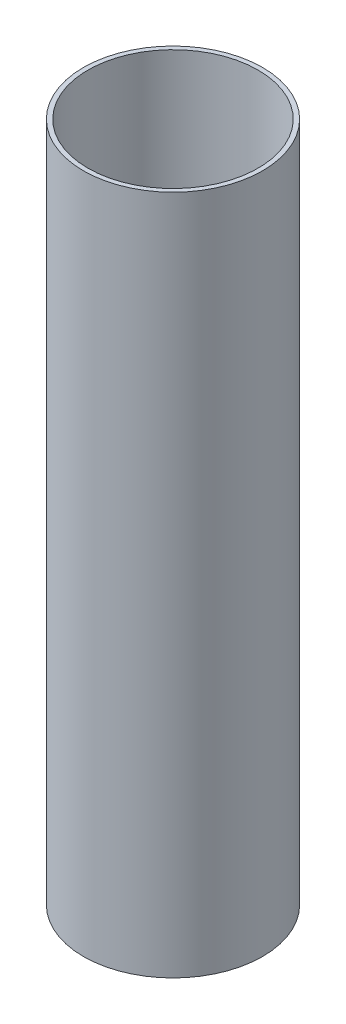
ISO-10303-21;
HEADER;
FILE_DESCRIPTION(('STEP AP214'),'2;1');
FILE_NAME('part.step','',(''),(''),'','','');
FILE_SCHEMA(('AUTOMOTIVE_DESIGN { 1 0 10303 214 1 1 1 1 }'));
ENDSEC;
DATA;
#1=APPLICATION_CONTEXT('core data for automotive mechanical design processes');
#2=APPLICATION_PROTOCOL_DEFINITION('international standard','automotive_design',2000,#1);
#3=PRODUCT_CONTEXT('',#1,'mechanical');
#4=PRODUCT('Part','Part','',(#3));
#5=PRODUCT_RELATED_PRODUCT_CATEGORY('part','',(#4));
#6=PRODUCT_DEFINITION_FORMATION('','',#4);
#7=PRODUCT_DEFINITION_CONTEXT('part definition',#1,'design');
#8=PRODUCT_DEFINITION('design','',#6,#7);
#9=PRODUCT_DEFINITION_SHAPE('','',#8);
#10=(LENGTH_UNIT() NAMED_UNIT(*) SI_UNIT(.MILLI.,.METRE.));
#11=(NAMED_UNIT(*) PLANE_ANGLE_UNIT() SI_UNIT($,.RADIAN.));
#12=(NAMED_UNIT(*) SI_UNIT($,.STERADIAN.) SOLID_ANGLE_UNIT());
#13=UNCERTAINTY_MEASURE_WITH_UNIT(LENGTH_MEASURE(1.E-05),#10,'distance_accuracy_value','');
#14=(GEOMETRIC_REPRESENTATION_CONTEXT(3) GLOBAL_UNCERTAINTY_ASSIGNED_CONTEXT((#13)) GLOBAL_UNIT_ASSIGNED_CONTEXT((#10,
#11,#12)) REPRESENTATION_CONTEXT('',''));
#15=CARTESIAN_POINT('',(0.,0.,0.));
#16=DIRECTION('',(0.,0.,1.));
#17=DIRECTION('',(1.,0.,0.));
#18=AXIS2_PLACEMENT_3D('',#15,#16,#17);
#19=CARTESIAN_POINT('',(0.,125.,0.));
#20=DIRECTION('',(0.,1.,0.));
#21=DIRECTION('',(0.,0.,1.));
#22=AXIS2_PLACEMENT_3D('',#19,#20,#21);
#23=PLANE('',#22);
#24=CARTESIAN_POINT('',(0.,125.,0.));
#25=DIRECTION('',(0.,1.,0.));
#26=DIRECTION('',(0.,0.,1.));
#27=AXIS2_PLACEMENT_3D('',#24,#25,#26);
#28=CIRCLE('',#27,32.9);
#29=CARTESIAN_POINT('',(0.,125.,32.9));
#30=VERTEX_POINT('',#29);
#31=EDGE_CURVE('E10',#30,#30,#28,.T.);
#32=ORIENTED_EDGE('',*,*,#31,.T.);
#33=EDGE_LOOP('',(#32));
#34=FACE_BOUND('',#33,.T.);
#35=CARTESIAN_POINT('',(0.,125.,0.));
#36=DIRECTION('',(0.,1.,0.));
#37=DIRECTION('',(0.,0.,1.));
#38=AXIS2_PLACEMENT_3D('',#35,#36,#37);
#39=CIRCLE('',#38,31.25);
#40=CARTESIAN_POINT('',(0.,125.,31.25));
#41=VERTEX_POINT('',#40);
#42=EDGE_CURVE('E42',#41,#41,#39,.T.);
#43=ORIENTED_EDGE('',*,*,#42,.F.);
#44=EDGE_LOOP('',(#43));
#45=FACE_BOUND('',#44,.T.);
#46=ADVANCED_FACE('F31',(#34,#45),#23,.T.);
#47=CARTESIAN_POINT('',(0.,-125.,0.));
#48=DIRECTION('',(0.,1.,0.));
#49=DIRECTION('',(0.,0.,1.));
#50=AXIS2_PLACEMENT_3D('',#47,#48,#49);
#51=PLANE('',#50);
#52=CARTESIAN_POINT('',(0.,-125.,0.));
#53=DIRECTION('',(0.,1.,0.));
#54=DIRECTION('',(0.,0.,1.));
#55=AXIS2_PLACEMENT_3D('',#52,#53,#54);
#56=CIRCLE('',#55,32.9);
#57=CARTESIAN_POINT('',(0.,-125.,32.9));
#58=VERTEX_POINT('',#57);
#59=EDGE_CURVE('E35',#58,#58,#56,.T.);
#60=ORIENTED_EDGE('',*,*,#59,.F.);
#61=EDGE_LOOP('',(#60));
#62=FACE_BOUND('',#61,.T.);
#63=CARTESIAN_POINT('',(0.,-125.,0.));
#64=DIRECTION('',(0.,1.,0.));
#65=DIRECTION('',(0.,0.,1.));
#66=AXIS2_PLACEMENT_3D('',#63,#64,#65);
#67=CIRCLE('',#66,31.25);
#68=CARTESIAN_POINT('',(0.,-125.,31.25));
#69=VERTEX_POINT('',#68);
#70=EDGE_CURVE('E44',#69,#69,#67,.T.);
#71=ORIENTED_EDGE('',*,*,#70,.T.);
#72=EDGE_LOOP('',(#71));
#73=FACE_BOUND('',#72,.T.);
#74=ADVANCED_FACE('F54',(#62,#73),#51,.F.);
#75=CARTESIAN_POINT('',(0.,125.,0.));
#76=DIRECTION('',(0.,-1.,0.));
#77=DIRECTION('',(0.,0.,-1.));
#78=AXIS2_PLACEMENT_3D('',#75,#76,#77);
#79=CYLINDRICAL_SURFACE('',#78,32.9);
#80=ORIENTED_EDGE('',*,*,#31,.F.);
#81=EDGE_LOOP('',(#80));
#82=FACE_BOUND('',#81,.T.);
#83=ORIENTED_EDGE('',*,*,#59,.T.);
#84=EDGE_LOOP('',(#83));
#85=FACE_BOUND('',#84,.T.);
#86=ADVANCED_FACE('F33',(#82,#85),#79,.T.);
#87=CARTESIAN_POINT('',(0.,125.,0.));
#88=DIRECTION('',(0.,-1.,0.));
#89=DIRECTION('',(0.,0.,-1.));
#90=AXIS2_PLACEMENT_3D('',#87,#88,#89);
#91=CYLINDRICAL_SURFACE('',#90,31.25);
#92=ORIENTED_EDGE('',*,*,#42,.T.);
#93=EDGE_LOOP('',(#92));
#94=FACE_BOUND('',#93,.T.);
#95=ORIENTED_EDGE('',*,*,#70,.F.);
#96=EDGE_LOOP('',(#95));
#97=FACE_BOUND('',#96,.T.);
#98=ADVANCED_FACE('F50',(#94,#97),#91,.F.);
#99=CLOSED_SHELL('',(#46,#74,#86,#98));
#100=MANIFOLD_SOLID_BREP('B2',#99);
#101=ADVANCED_BREP_SHAPE_REPRESENTATION('',(#18,#100),#14);
#102=SHAPE_DEFINITION_REPRESENTATION(#9,#101);
ENDSEC;
END-ISO-10303-21;
